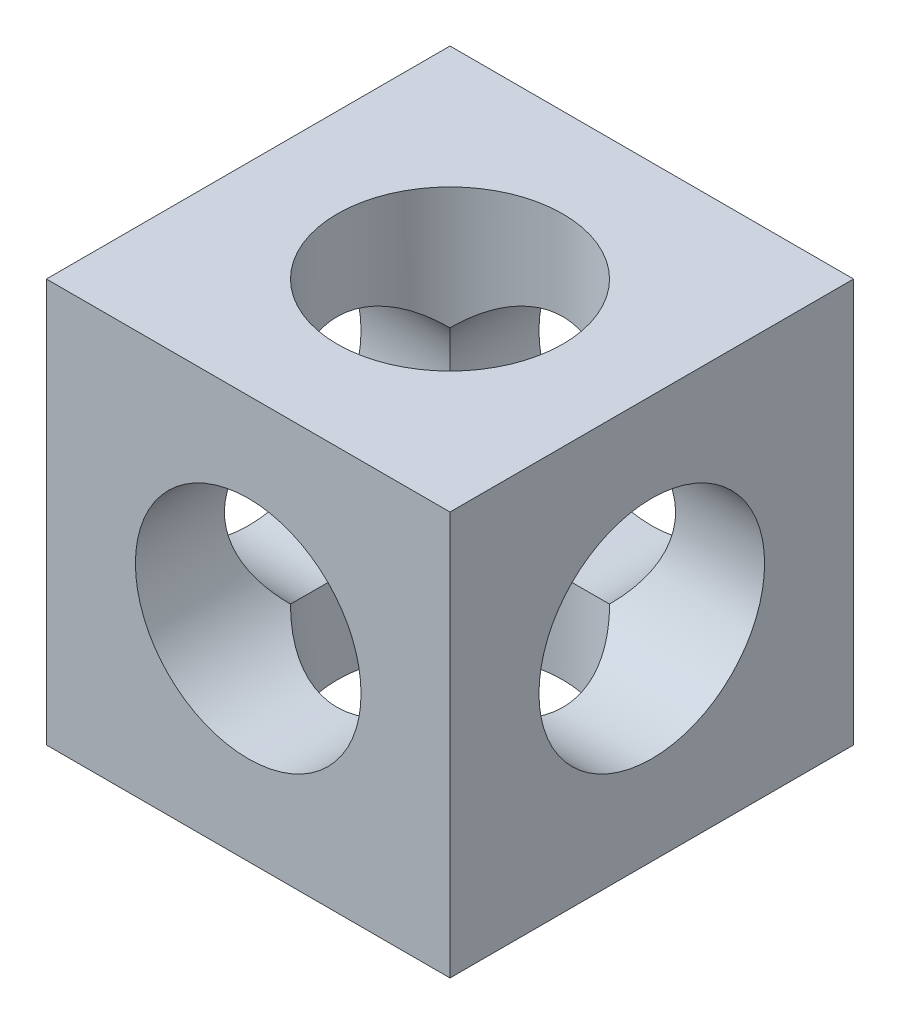
ISO-10303-21;
HEADER;
FILE_DESCRIPTION(('STEP AP214'),'2;1');
FILE_NAME('part.step','',(''),(''),'','','');
FILE_SCHEMA(('AUTOMOTIVE_DESIGN { 1 0 10303 214 1 1 1 1 }'));
ENDSEC;
DATA;
#1=APPLICATION_CONTEXT('core data for automotive mechanical design processes');
#2=APPLICATION_PROTOCOL_DEFINITION('international standard','automotive_design',2000,#1);
#3=PRODUCT_CONTEXT('',#1,'mechanical');
#4=PRODUCT('Part','Part','',(#3));
#5=PRODUCT_RELATED_PRODUCT_CATEGORY('part','',(#4));
#6=PRODUCT_DEFINITION_FORMATION('','',#4);
#7=PRODUCT_DEFINITION_CONTEXT('part definition',#1,'design');
#8=PRODUCT_DEFINITION('design','',#6,#7);
#9=PRODUCT_DEFINITION_SHAPE('','',#8);
#10=(LENGTH_UNIT() NAMED_UNIT(*) SI_UNIT(.MILLI.,.METRE.));
#11=(NAMED_UNIT(*) PLANE_ANGLE_UNIT() SI_UNIT($,.RADIAN.));
#12=(NAMED_UNIT(*) SI_UNIT($,.STERADIAN.) SOLID_ANGLE_UNIT());
#13=UNCERTAINTY_MEASURE_WITH_UNIT(LENGTH_MEASURE(1.E-05),#10,'distance_accuracy_value','');
#14=(GEOMETRIC_REPRESENTATION_CONTEXT(3) GLOBAL_UNCERTAINTY_ASSIGNED_CONTEXT((#13)) GLOBAL_UNIT_ASSIGNED_CONTEXT((#10,
#11,#12)) REPRESENTATION_CONTEXT('',''));
#15=CARTESIAN_POINT('',(0.,0.,0.));
#16=DIRECTION('',(0.,0.,1.));
#17=DIRECTION('',(1.,0.,0.));
#18=AXIS2_PLACEMENT_3D('',#15,#16,#17);
#19=CARTESIAN_POINT('',(6.35,0.,-6.35));
#20=DIRECTION('',(0.,1.,0.));
#21=DIRECTION('',(0.,0.,1.));
#22=AXIS2_PLACEMENT_3D('',#19,#20,#21);
#23=CYLINDRICAL_SURFACE('',#22,3.55);
#24=CARTESIAN_POINT('',(6.35,12.7,-6.35));
#25=DIRECTION('',(0.,1.,0.));
#26=DIRECTION('',(0.,0.,1.));
#27=AXIS2_PLACEMENT_3D('',#24,#25,#26);
#28=CIRCLE('',#27,3.55);
#29=CARTESIAN_POINT('',(6.35,12.7,-2.8));
#30=VERTEX_POINT('',#29);
#31=EDGE_CURVE('E137',#30,#30,#28,.T.);
#32=ORIENTED_EDGE('',*,*,#31,.T.);
#33=EDGE_LOOP('',(#32));
#34=FACE_BOUND('',#33,.T.);
#35=CARTESIAN_POINT('',(6.35,6.35,-6.35));
#36=DIRECTION('',(0.707106781186547,0.707106781186547,0.));
#37=DIRECTION('',(-0.707106781186547,0.707106781186547,0.));
#38=AXIS2_PLACEMENT_3D('',#35,#36,#37);
#39=ELLIPSE('',#38,5.02045814642449,3.55);
#40=CARTESIAN_POINT('',(3.83977092678776,8.86022907321224,-3.83977092678776));
#41=VERTEX_POINT('',#40);
#42=CARTESIAN_POINT('',(3.83977092678776,8.86022907321224,-8.86022907321225));
#43=VERTEX_POINT('',#42);
#44=EDGE_CURVE('E101',#41,#43,#39,.F.);
#45=ORIENTED_EDGE('',*,*,#44,.T.);
#46=CARTESIAN_POINT('',(6.35,6.35,-6.35));
#47=DIRECTION('',(0.,0.707106781186547,0.707106781186547));
#48=DIRECTION('',(0.,0.707106781186547,-0.707106781186547));
#49=AXIS2_PLACEMENT_3D('',#46,#47,#48);
#50=ELLIPSE('',#49,5.02045814642449,3.55);
#51=CARTESIAN_POINT('',(8.86022907321224,8.86022907321224,-8.86022907321224));
#52=VERTEX_POINT('',#51);
#53=EDGE_CURVE('E47',#43,#52,#50,.F.);
#54=ORIENTED_EDGE('',*,*,#53,.T.);
#55=CARTESIAN_POINT('',(6.35,6.35,-6.35));
#56=DIRECTION('',(-0.707106781186547,0.707106781186547,0.));
#57=DIRECTION('',(0.707106781186547,0.707106781186547,0.));
#58=AXIS2_PLACEMENT_3D('',#55,#56,#57);
#59=ELLIPSE('',#58,5.02045814642449,3.55);
#60=CARTESIAN_POINT('',(8.86022907321224,8.86022907321224,-3.83977092678776));
#61=VERTEX_POINT('',#60);
#62=EDGE_CURVE('E113',#52,#61,#59,.F.);
#63=ORIENTED_EDGE('',*,*,#62,.T.);
#64=CARTESIAN_POINT('',(6.35,6.35,-6.35));
#65=DIRECTION('',(0.,0.707106781186547,-0.707106781186547));
#66=DIRECTION('',(0.,0.707106781186547,0.707106781186547));
#67=AXIS2_PLACEMENT_3D('',#64,#65,#66);
#68=ELLIPSE('',#67,5.02045814642449,3.55);
#69=EDGE_CURVE('E124',#61,#41,#68,.F.);
#70=ORIENTED_EDGE('',*,*,#69,.T.);
#71=EDGE_LOOP('',(#45,#54,#63,#70));
#72=FACE_BOUND('',#71,.T.);
#73=ADVANCED_FACE('F32',(#34,#72),#23,.F.);
#74=CARTESIAN_POINT('',(0.,12.7,0.));
#75=DIRECTION('',(1.,0.,0.));
#76=DIRECTION('',(0.,0.,-1.));
#77=AXIS2_PLACEMENT_3D('',#74,#75,#76);
#78=PLANE('',#77);
#79=CARTESIAN_POINT('',(0.,6.35,-6.35));
#80=DIRECTION('',(1.,0.,0.));
#81=DIRECTION('',(0.,0.,-1.));
#82=AXIS2_PLACEMENT_3D('',#79,#80,#81);
#83=CIRCLE('',#82,3.55);
#84=CARTESIAN_POINT('',(0.,6.35,-9.9));
#85=VERTEX_POINT('',#84);
#86=EDGE_CURVE('E134',#85,#85,#83,.T.);
#87=ORIENTED_EDGE('',*,*,#86,.T.);
#88=EDGE_LOOP('',(#87));
#89=FACE_BOUND('',#88,.T.);
#90=DIRECTION('',(0.,0.,1.));
#91=VECTOR('',#90,1.);
#92=CARTESIAN_POINT('',(0.,0.,0.));
#93=LINE('',#92,#91);
#94=CARTESIAN_POINT('',(0.,0.,-12.7));
#95=VERTEX_POINT('',#94);
#96=CARTESIAN_POINT('',(0.,0.,0.));
#97=VERTEX_POINT('',#96);
#98=EDGE_CURVE('E143',#95,#97,#93,.T.);
#99=ORIENTED_EDGE('',*,*,#98,.T.);
#100=DIRECTION('',(0.,-1.,0.));
#101=VECTOR('',#100,1.);
#102=CARTESIAN_POINT('',(0.,12.7,0.));
#103=LINE('',#102,#101);
#104=CARTESIAN_POINT('',(0.,12.7,0.));
#105=VERTEX_POINT('',#104);
#106=EDGE_CURVE('E117',#105,#97,#103,.T.);
#107=ORIENTED_EDGE('',*,*,#106,.F.);
#108=DIRECTION('',(0.,0.,1.));
#109=VECTOR('',#108,1.);
#110=CARTESIAN_POINT('',(0.,12.7,0.));
#111=LINE('',#110,#109);
#112=CARTESIAN_POINT('',(0.,12.7,-12.7));
#113=VERTEX_POINT('',#112);
#114=EDGE_CURVE('E146',#113,#105,#111,.T.);
#115=ORIENTED_EDGE('',*,*,#114,.F.);
#116=DIRECTION('',(0.,-1.,0.));
#117=VECTOR('',#116,1.);
#118=CARTESIAN_POINT('',(0.,12.7,-12.7));
#119=LINE('',#118,#117);
#120=EDGE_CURVE('E156',#113,#95,#119,.T.);
#121=ORIENTED_EDGE('',*,*,#120,.T.);
#122=EDGE_LOOP('',(#99,#107,#115,#121));
#123=FACE_BOUND('',#122,.T.);
#124=ADVANCED_FACE('F34',(#89,#123),#78,.F.);
#125=CARTESIAN_POINT('',(0.,12.7,0.));
#126=DIRECTION('',(0.,0.,-1.));
#127=DIRECTION('',(-1.,0.,0.));
#128=AXIS2_PLACEMENT_3D('',#125,#126,#127);
#129=PLANE('',#128);
#130=CARTESIAN_POINT('',(6.35,6.35,0.));
#131=DIRECTION('',(0.,0.,1.));
#132=DIRECTION('',(1.,0.,0.));
#133=AXIS2_PLACEMENT_3D('',#130,#131,#132);
#134=CIRCLE('',#133,3.55);
#135=CARTESIAN_POINT('',(9.9,6.35,0.));
#136=VERTEX_POINT('',#135);
#137=EDGE_CURVE('E234',#136,#136,#134,.T.);
#138=ORIENTED_EDGE('',*,*,#137,.F.);
#139=EDGE_LOOP('',(#138));
#140=FACE_BOUND('',#139,.T.);
#141=DIRECTION('',(1.,0.,0.));
#142=VECTOR('',#141,1.);
#143=CARTESIAN_POINT('',(0.,0.,0.));
#144=LINE('',#143,#142);
#145=CARTESIAN_POINT('',(12.7,0.,0.));
#146=VERTEX_POINT('',#145);
#147=EDGE_CURVE('E159',#97,#146,#144,.T.);
#148=ORIENTED_EDGE('',*,*,#147,.T.);
#149=DIRECTION('',(0.,-1.,0.));
#150=VECTOR('',#149,1.);
#151=CARTESIAN_POINT('',(12.7,12.7,0.));
#152=LINE('',#151,#150);
#153=CARTESIAN_POINT('',(12.7,12.7,0.));
#154=VERTEX_POINT('',#153);
#155=EDGE_CURVE('E169',#154,#146,#152,.T.);
#156=ORIENTED_EDGE('',*,*,#155,.F.);
#157=DIRECTION('',(1.,0.,0.));
#158=VECTOR('',#157,1.);
#159=CARTESIAN_POINT('',(0.,12.7,0.));
#160=LINE('',#159,#158);
#161=EDGE_CURVE('E149',#105,#154,#160,.T.);
#162=ORIENTED_EDGE('',*,*,#161,.F.);
#163=ORIENTED_EDGE('',*,*,#106,.T.);
#164=EDGE_LOOP('',(#148,#156,#162,#163));
#165=FACE_BOUND('',#164,.T.);
#166=ADVANCED_FACE('F174',(#140,#165),#129,.F.);
#167=CARTESIAN_POINT('',(12.7,12.7,0.));
#168=DIRECTION('',(-1.,0.,0.));
#169=DIRECTION('',(0.,0.,1.));
#170=AXIS2_PLACEMENT_3D('',#167,#168,#169);
#171=PLANE('',#170);
#172=CARTESIAN_POINT('',(12.7,6.35,-6.35));
#173=DIRECTION('',(1.,0.,0.));
#174=DIRECTION('',(0.,0.,-1.));
#175=AXIS2_PLACEMENT_3D('',#172,#173,#174);
#176=CIRCLE('',#175,3.55);
#177=CARTESIAN_POINT('',(12.7,6.35,-9.9));
#178=VERTEX_POINT('',#177);
#179=EDGE_CURVE('E128',#178,#178,#176,.T.);
#180=ORIENTED_EDGE('',*,*,#179,.F.);
#181=EDGE_LOOP('',(#180));
#182=FACE_BOUND('',#181,.T.);
#183=DIRECTION('',(0.,0.,-1.));
#184=VECTOR('',#183,1.);
#185=CARTESIAN_POINT('',(12.7,0.,0.));
#186=LINE('',#185,#184);
#187=CARTESIAN_POINT('',(12.7,0.,-12.7));
#188=VERTEX_POINT('',#187);
#189=EDGE_CURVE('E161',#146,#188,#186,.T.);
#190=ORIENTED_EDGE('',*,*,#189,.T.);
#191=DIRECTION('',(0.,-1.,0.));
#192=VECTOR('',#191,1.);
#193=CARTESIAN_POINT('',(12.7,12.7,-12.7));
#194=LINE('',#193,#192);
#195=CARTESIAN_POINT('',(12.7,12.7,-12.7));
#196=VERTEX_POINT('',#195);
#197=EDGE_CURVE('E166',#196,#188,#194,.T.);
#198=ORIENTED_EDGE('',*,*,#197,.F.);
#199=DIRECTION('',(0.,0.,-1.));
#200=VECTOR('',#199,1.);
#201=CARTESIAN_POINT('',(12.7,12.7,0.));
#202=LINE('',#201,#200);
#203=EDGE_CURVE('E152',#154,#196,#202,.T.);
#204=ORIENTED_EDGE('',*,*,#203,.F.);
#205=ORIENTED_EDGE('',*,*,#155,.T.);
#206=EDGE_LOOP('',(#190,#198,#204,#205));
#207=FACE_BOUND('',#206,.T.);
#208=ADVANCED_FACE('F186',(#182,#207),#171,.F.);
#209=CARTESIAN_POINT('',(0.,12.7,-12.7));
#210=DIRECTION('',(0.,0.,1.));
#211=DIRECTION('',(1.,0.,0.));
#212=AXIS2_PLACEMENT_3D('',#209,#210,#211);
#213=PLANE('',#212);
#214=CARTESIAN_POINT('',(6.35,6.35,-12.7));
#215=DIRECTION('',(0.,0.,1.));
#216=DIRECTION('',(1.,0.,0.));
#217=AXIS2_PLACEMENT_3D('',#214,#215,#216);
#218=CIRCLE('',#217,3.55);
#219=CARTESIAN_POINT('',(9.9,6.35,-12.7));
#220=VERTEX_POINT('',#219);
#221=EDGE_CURVE('E110',#220,#220,#218,.T.);
#222=ORIENTED_EDGE('',*,*,#221,.T.);
#223=EDGE_LOOP('',(#222));
#224=FACE_BOUND('',#223,.T.);
#225=DIRECTION('',(-1.,0.,0.));
#226=VECTOR('',#225,1.);
#227=CARTESIAN_POINT('',(0.,0.,-12.7));
#228=LINE('',#227,#226);
#229=EDGE_CURVE('E150',#188,#95,#228,.T.);
#230=ORIENTED_EDGE('',*,*,#229,.T.);
#231=ORIENTED_EDGE('',*,*,#120,.F.);
#232=DIRECTION('',(-1.,0.,0.));
#233=VECTOR('',#232,1.);
#234=CARTESIAN_POINT('',(0.,12.7,-12.7));
#235=LINE('',#234,#233);
#236=EDGE_CURVE('E154',#196,#113,#235,.T.);
#237=ORIENTED_EDGE('',*,*,#236,.F.);
#238=ORIENTED_EDGE('',*,*,#197,.T.);
#239=EDGE_LOOP('',(#230,#231,#237,#238));
#240=FACE_BOUND('',#239,.T.);
#241=ADVANCED_FACE('F190',(#224,#240),#213,.F.);
#242=CARTESIAN_POINT('',(0.,12.7,0.));
#243=DIRECTION('',(0.,-1.,0.));
#244=DIRECTION('',(0.,0.,-1.));
#245=AXIS2_PLACEMENT_3D('',#242,#243,#244);
#246=PLANE('',#245);
#247=ORIENTED_EDGE('',*,*,#31,.F.);
#248=EDGE_LOOP('',(#247));
#249=FACE_BOUND('',#248,.T.);
#250=ORIENTED_EDGE('',*,*,#114,.T.);
#251=ORIENTED_EDGE('',*,*,#161,.T.);
#252=ORIENTED_EDGE('',*,*,#203,.T.);
#253=ORIENTED_EDGE('',*,*,#236,.T.);
#254=EDGE_LOOP('',(#250,#251,#252,#253));
#255=FACE_BOUND('',#254,.T.);
#256=ADVANCED_FACE('F192',(#249,#255),#246,.F.);
#257=CARTESIAN_POINT('',(0.,0.,0.));
#258=DIRECTION('',(0.,-1.,0.));
#259=DIRECTION('',(0.,0.,-1.));
#260=AXIS2_PLACEMENT_3D('',#257,#258,#259);
#261=PLANE('',#260);
#262=CARTESIAN_POINT('',(6.35,0.,-6.35));
#263=DIRECTION('',(0.,1.,0.));
#264=DIRECTION('',(0.,0.,1.));
#265=AXIS2_PLACEMENT_3D('',#262,#263,#264);
#266=CIRCLE('',#265,3.55);
#267=CARTESIAN_POINT('',(6.35,0.,-2.8));
#268=VERTEX_POINT('',#267);
#269=EDGE_CURVE('E140',#268,#268,#266,.T.);
#270=ORIENTED_EDGE('',*,*,#269,.T.);
#271=EDGE_LOOP('',(#270));
#272=FACE_BOUND('',#271,.T.);
#273=ORIENTED_EDGE('',*,*,#98,.F.);
#274=ORIENTED_EDGE('',*,*,#229,.F.);
#275=ORIENTED_EDGE('',*,*,#189,.F.);
#276=ORIENTED_EDGE('',*,*,#147,.F.);
#277=EDGE_LOOP('',(#273,#274,#275,#276));
#278=FACE_BOUND('',#277,.T.);
#279=ADVANCED_FACE('F182',(#272,#278),#261,.T.);
#280=CARTESIAN_POINT('',(6.35,6.35,-6.35));
#281=DIRECTION('',(-0.707106781186547,0.707106781186547,0.));
#282=DIRECTION('',(0.707106781186547,0.707106781186547,0.));
#283=AXIS2_PLACEMENT_3D('',#280,#281,#282);
#284=ELLIPSE('',#283,5.02045814642449,3.55);
#285=CARTESIAN_POINT('',(3.83977092678776,3.83977092678776,-8.86022907321225));
#286=VERTEX_POINT('',#285);
#287=CARTESIAN_POINT('',(3.83977092678776,3.83977092678776,-3.83977092678776));
#288=VERTEX_POINT('',#287);
#289=EDGE_CURVE('E107',#286,#288,#284,.T.);
#290=ORIENTED_EDGE('',*,*,#289,.T.);
#291=CARTESIAN_POINT('',(6.35,6.35,-6.35));
#292=DIRECTION('',(0.,0.707106781186547,0.707106781186547));
#293=DIRECTION('',(0.,0.707106781186547,-0.707106781186547));
#294=AXIS2_PLACEMENT_3D('',#291,#292,#293);
#295=ELLIPSE('',#294,5.02045814642449,3.55);
#296=CARTESIAN_POINT('',(8.86022907321224,3.83977092678776,-3.83977092678776));
#297=VERTEX_POINT('',#296);
#298=EDGE_CURVE('E55',#288,#297,#295,.T.);
#299=ORIENTED_EDGE('',*,*,#298,.T.);
#300=CARTESIAN_POINT('',(6.35,6.35,-6.35));
#301=DIRECTION('',(0.707106781186547,0.707106781186547,0.));
#302=DIRECTION('',(-0.707106781186547,0.707106781186547,0.));
#303=AXIS2_PLACEMENT_3D('',#300,#301,#302);
#304=ELLIPSE('',#303,5.02045814642449,3.55);
#305=CARTESIAN_POINT('',(8.86022907321224,3.83977092678776,-8.86022907321224));
#306=VERTEX_POINT('',#305);
#307=EDGE_CURVE('E109',#297,#306,#304,.T.);
#308=ORIENTED_EDGE('',*,*,#307,.T.);
#309=CARTESIAN_POINT('',(6.35,6.35,-6.35));
#310=DIRECTION('',(0.,0.707106781186547,-0.707106781186547));
#311=DIRECTION('',(0.,0.707106781186547,0.707106781186547));
#312=AXIS2_PLACEMENT_3D('',#309,#310,#311);
#313=ELLIPSE('',#312,5.02045814642449,3.55);
#314=EDGE_CURVE('E95',#306,#286,#313,.T.);
#315=ORIENTED_EDGE('',*,*,#314,.T.);
#316=EDGE_LOOP('',(#290,#299,#308,#315));
#317=FACE_BOUND('',#316,.T.);
#318=ORIENTED_EDGE('',*,*,#269,.F.);
#319=EDGE_LOOP('',(#318));
#320=FACE_BOUND('',#319,.T.);
#321=ADVANCED_FACE('F105',(#317,#320),#23,.F.);
#322=CARTESIAN_POINT('',(0.,6.35,-6.35));
#323=DIRECTION('',(1.,0.,0.));
#324=DIRECTION('',(0.,0.,-1.));
#325=AXIS2_PLACEMENT_3D('',#322,#323,#324);
#326=CYLINDRICAL_SURFACE('',#325,3.55);
#327=ORIENTED_EDGE('',*,*,#179,.T.);
#328=EDGE_LOOP('',(#327));
#329=FACE_BOUND('',#328,.T.);
#330=ORIENTED_EDGE('',*,*,#62,.F.);
#331=CARTESIAN_POINT('',(6.35,6.35,-6.35));
#332=DIRECTION('',(0.707106781186547,0.,0.707106781186547));
#333=DIRECTION('',(0.707106781186547,0.,-0.707106781186547));
#334=AXIS2_PLACEMENT_3D('',#331,#332,#333);
#335=ELLIPSE('',#334,5.02045814642449,3.55);
#336=EDGE_CURVE('E130',#52,#306,#335,.F.);
#337=ORIENTED_EDGE('',*,*,#336,.T.);
#338=ORIENTED_EDGE('',*,*,#307,.F.);
#339=CARTESIAN_POINT('',(6.35,6.35,-6.35));
#340=DIRECTION('',(0.707106781186547,0.,-0.707106781186547));
#341=DIRECTION('',(0.707106781186547,0.,0.707106781186547));
#342=AXIS2_PLACEMENT_3D('',#339,#340,#341);
#343=ELLIPSE('',#342,5.02045814642449,3.55);
#344=EDGE_CURVE('E126',#297,#61,#343,.F.);
#345=ORIENTED_EDGE('',*,*,#344,.T.);
#346=EDGE_LOOP('',(#330,#337,#338,#345));
#347=FACE_BOUND('',#346,.T.);
#348=ADVANCED_FACE('F214',(#329,#347),#326,.F.);
#349=ORIENTED_EDGE('',*,*,#86,.F.);
#350=EDGE_LOOP('',(#349));
#351=FACE_BOUND('',#350,.T.);
#352=ORIENTED_EDGE('',*,*,#44,.F.);
#353=CARTESIAN_POINT('',(6.35,6.35,-6.35));
#354=DIRECTION('',(0.707106781186547,0.,0.707106781186547));
#355=DIRECTION('',(0.707106781186547,0.,-0.707106781186547));
#356=AXIS2_PLACEMENT_3D('',#353,#354,#355);
#357=ELLIPSE('',#356,5.02045814642449,3.55);
#358=EDGE_CURVE('E11',#41,#288,#357,.T.);
#359=ORIENTED_EDGE('',*,*,#358,.T.);
#360=ORIENTED_EDGE('',*,*,#289,.F.);
#361=CARTESIAN_POINT('',(6.35,6.35,-6.35));
#362=DIRECTION('',(0.707106781186547,0.,-0.707106781186547));
#363=DIRECTION('',(0.707106781186547,0.,0.707106781186547));
#364=AXIS2_PLACEMENT_3D('',#361,#362,#363);
#365=ELLIPSE('',#364,5.02045814642449,3.55);
#366=EDGE_CURVE('E40',#286,#43,#365,.T.);
#367=ORIENTED_EDGE('',*,*,#366,.T.);
#368=EDGE_LOOP('',(#352,#359,#360,#367));
#369=FACE_BOUND('',#368,.T.);
#370=ADVANCED_FACE('F112',(#351,#369),#326,.F.);
#371=CARTESIAN_POINT('',(6.35,6.35,-12.7));
#372=DIRECTION('',(0.,0.,1.));
#373=DIRECTION('',(1.,0.,0.));
#374=AXIS2_PLACEMENT_3D('',#371,#372,#373);
#375=CYLINDRICAL_SURFACE('',#374,3.55);
#376=ORIENTED_EDGE('',*,*,#221,.F.);
#377=EDGE_LOOP('',(#376));
#378=FACE_BOUND('',#377,.T.);
#379=ORIENTED_EDGE('',*,*,#53,.F.);
#380=ORIENTED_EDGE('',*,*,#366,.F.);
#381=ORIENTED_EDGE('',*,*,#314,.F.);
#382=ORIENTED_EDGE('',*,*,#336,.F.);
#383=EDGE_LOOP('',(#379,#380,#381,#382));
#384=FACE_BOUND('',#383,.T.);
#385=ADVANCED_FACE('F94',(#378,#384),#375,.F.);
#386=ORIENTED_EDGE('',*,*,#137,.T.);
#387=EDGE_LOOP('',(#386));
#388=FACE_BOUND('',#387,.T.);
#389=ORIENTED_EDGE('',*,*,#298,.F.);
#390=ORIENTED_EDGE('',*,*,#358,.F.);
#391=ORIENTED_EDGE('',*,*,#69,.F.);
#392=ORIENTED_EDGE('',*,*,#344,.F.);
#393=EDGE_LOOP('',(#389,#390,#391,#392));
#394=FACE_BOUND('',#393,.T.);
#395=ADVANCED_FACE('F225',(#388,#394),#375,.F.);
#396=CLOSED_SHELL('',(#73,#124,#166,#208,#241,#256,#279,#321,#348,#370,#385,#395));
#397=MANIFOLD_SOLID_BREP('B2',#396);
#398=ADVANCED_BREP_SHAPE_REPRESENTATION('',(#18,#397),#14);
#399=SHAPE_DEFINITION_REPRESENTATION(#9,#398);
ENDSEC;
END-ISO-10303-21;
